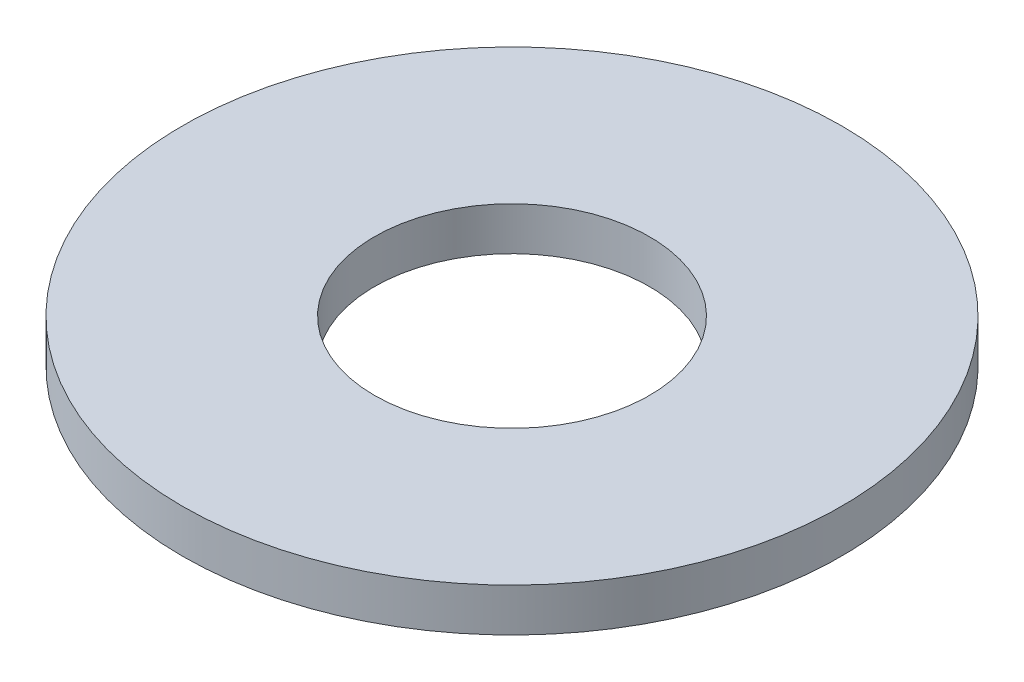
ISO-10303-21;
HEADER;
FILE_DESCRIPTION(('STEP AP214'),'2;1');
FILE_NAME('part.step','',(''),(''),'','','');
FILE_SCHEMA(('AUTOMOTIVE_DESIGN { 1 0 10303 214 1 1 1 1 }'));
ENDSEC;
DATA;
#1=APPLICATION_CONTEXT('core data for automotive mechanical design processes');
#2=APPLICATION_PROTOCOL_DEFINITION('international standard','automotive_design',2000,#1);
#3=PRODUCT_CONTEXT('',#1,'mechanical');
#4=PRODUCT('Part','Part','',(#3));
#5=PRODUCT_RELATED_PRODUCT_CATEGORY('part','',(#4));
#6=PRODUCT_DEFINITION_FORMATION('','',#4);
#7=PRODUCT_DEFINITION_CONTEXT('part definition',#1,'design');
#8=PRODUCT_DEFINITION('design','',#6,#7);
#9=PRODUCT_DEFINITION_SHAPE('','',#8);
#10=(LENGTH_UNIT() NAMED_UNIT(*) SI_UNIT(.MILLI.,.METRE.));
#11=(NAMED_UNIT(*) PLANE_ANGLE_UNIT() SI_UNIT($,.RADIAN.));
#12=(NAMED_UNIT(*) SI_UNIT($,.STERADIAN.) SOLID_ANGLE_UNIT());
#13=UNCERTAINTY_MEASURE_WITH_UNIT(LENGTH_MEASURE(1.E-05),#10,'distance_accuracy_value','');
#14=(GEOMETRIC_REPRESENTATION_CONTEXT(3) GLOBAL_UNCERTAINTY_ASSIGNED_CONTEXT((#13)) GLOBAL_UNIT_ASSIGNED_CONTEXT((#10,
#11,#12)) REPRESENTATION_CONTEXT('',''));
#15=CARTESIAN_POINT('',(0.,0.,0.));
#16=DIRECTION('',(0.,0.,1.));
#17=DIRECTION('',(1.,0.,0.));
#18=AXIS2_PLACEMENT_3D('',#15,#16,#17);
#19=CARTESIAN_POINT('',(0.,5.,0.));
#20=DIRECTION('',(0.,1.,0.));
#21=DIRECTION('',(0.,0.,1.));
#22=AXIS2_PLACEMENT_3D('',#19,#20,#21);
#23=PLANE('',#22);
#24=CARTESIAN_POINT('',(0.,5.,0.));
#25=DIRECTION('',(0.,1.,0.));
#26=DIRECTION('',(0.,0.,1.));
#27=AXIS2_PLACEMENT_3D('',#24,#25,#26);
#28=CIRCLE('',#27,38.1);
#29=CARTESIAN_POINT('',(0.,5.,38.1));
#30=VERTEX_POINT('',#29);
#31=EDGE_CURVE('E10',#30,#30,#28,.T.);
#32=ORIENTED_EDGE('',*,*,#31,.T.);
#33=EDGE_LOOP('',(#32));
#34=FACE_BOUND('',#33,.T.);
#35=CARTESIAN_POINT('',(0.,5.,0.));
#36=DIRECTION('',(0.,1.,0.));
#37=DIRECTION('',(0.,0.,1.));
#38=AXIS2_PLACEMENT_3D('',#35,#36,#37);
#39=CIRCLE('',#38,15.9);
#40=CARTESIAN_POINT('',(0.,5.,15.9));
#41=VERTEX_POINT('',#40);
#42=EDGE_CURVE('E50',#41,#41,#39,.T.);
#43=ORIENTED_EDGE('',*,*,#42,.F.);
#44=EDGE_LOOP('',(#43));
#45=FACE_BOUND('',#44,.T.);
#46=ADVANCED_FACE('F37',(#34,#45),#23,.T.);
#47=CARTESIAN_POINT('',(0.,0.,0.));
#48=DIRECTION('',(0.,1.,0.));
#49=DIRECTION('',(0.,0.,1.));
#50=AXIS2_PLACEMENT_3D('',#47,#48,#49);
#51=PLANE('',#50);
#52=CARTESIAN_POINT('',(0.,0.,0.));
#53=DIRECTION('',(0.,1.,0.));
#54=DIRECTION('',(0.,0.,1.));
#55=AXIS2_PLACEMENT_3D('',#52,#53,#54);
#56=CIRCLE('',#55,38.1);
#57=CARTESIAN_POINT('',(0.,0.,38.1));
#58=VERTEX_POINT('',#57);
#59=EDGE_CURVE('E41',#58,#58,#56,.T.);
#60=ORIENTED_EDGE('',*,*,#59,.F.);
#61=EDGE_LOOP('',(#60));
#62=FACE_BOUND('',#61,.T.);
#63=CARTESIAN_POINT('',(0.,0.,0.));
#64=DIRECTION('',(0.,1.,0.));
#65=DIRECTION('',(0.,0.,1.));
#66=AXIS2_PLACEMENT_3D('',#63,#64,#65);
#67=CIRCLE('',#66,15.9);
#68=CARTESIAN_POINT('',(0.,0.,15.9));
#69=VERTEX_POINT('',#68);
#70=EDGE_CURVE('E52',#69,#69,#67,.T.);
#71=ORIENTED_EDGE('',*,*,#70,.T.);
#72=EDGE_LOOP('',(#71));
#73=FACE_BOUND('',#72,.T.);
#74=ADVANCED_FACE('F64',(#62,#73),#51,.F.);
#75=CARTESIAN_POINT('',(0.,5.,0.));
#76=DIRECTION('',(0.,-1.,0.));
#77=DIRECTION('',(0.,0.,-1.));
#78=AXIS2_PLACEMENT_3D('',#75,#76,#77);
#79=CYLINDRICAL_SURFACE('',#78,38.1);
#80=ORIENTED_EDGE('',*,*,#31,.F.);
#81=EDGE_LOOP('',(#80));
#82=FACE_BOUND('',#81,.T.);
#83=ORIENTED_EDGE('',*,*,#59,.T.);
#84=EDGE_LOOP('',(#83));
#85=FACE_BOUND('',#84,.T.);
#86=ADVANCED_FACE('F39',(#82,#85),#79,.T.);
#87=CARTESIAN_POINT('',(0.,5.,0.));
#88=DIRECTION('',(0.,-1.,0.));
#89=DIRECTION('',(0.,0.,-1.));
#90=AXIS2_PLACEMENT_3D('',#87,#88,#89);
#91=CYLINDRICAL_SURFACE('',#90,15.9);
#92=ORIENTED_EDGE('',*,*,#42,.T.);
#93=EDGE_LOOP('',(#92));
#94=FACE_BOUND('',#93,.T.);
#95=ORIENTED_EDGE('',*,*,#70,.F.);
#96=EDGE_LOOP('',(#95));
#97=FACE_BOUND('',#96,.T.);
#98=ADVANCED_FACE('F60',(#94,#97),#91,.F.);
#99=CLOSED_SHELL('',(#46,#74,#86,#98));
#100=MANIFOLD_SOLID_BREP('B2',#99);
#101=ADVANCED_BREP_SHAPE_REPRESENTATION('',(#18,#100),#14);
#102=SHAPE_DEFINITION_REPRESENTATION(#9,#101);
ENDSEC;
END-ISO-10303-21;
